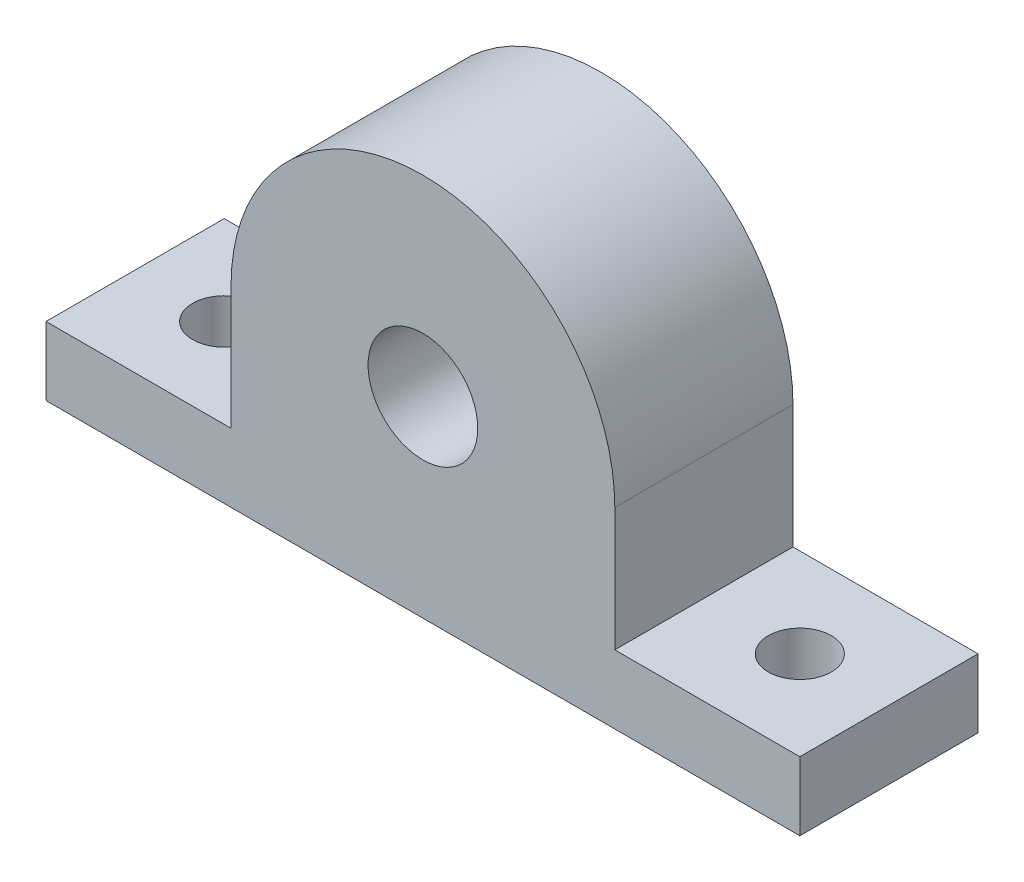
ISO-10303-21;
HEADER;
FILE_DESCRIPTION(('STEP AP214'),'2;1');
FILE_NAME('part.step','',(''),(''),'','','');
FILE_SCHEMA(('AUTOMOTIVE_DESIGN { 1 0 10303 214 1 1 1 1 }'));
ENDSEC;
DATA;
#1=APPLICATION_CONTEXT('core data for automotive mechanical design processes');
#2=APPLICATION_PROTOCOL_DEFINITION('international standard','automotive_design',2000,#1);
#3=PRODUCT_CONTEXT('',#1,'mechanical');
#4=PRODUCT('Part','Part','',(#3));
#5=PRODUCT_RELATED_PRODUCT_CATEGORY('part','',(#4));
#6=PRODUCT_DEFINITION_FORMATION('','',#4);
#7=PRODUCT_DEFINITION_CONTEXT('part definition',#1,'design');
#8=PRODUCT_DEFINITION('design','',#6,#7);
#9=PRODUCT_DEFINITION_SHAPE('','',#8);
#10=(LENGTH_UNIT() NAMED_UNIT(*) SI_UNIT(.MILLI.,.METRE.));
#11=(NAMED_UNIT(*) PLANE_ANGLE_UNIT() SI_UNIT($,.RADIAN.));
#12=(NAMED_UNIT(*) SI_UNIT($,.STERADIAN.) SOLID_ANGLE_UNIT());
#13=UNCERTAINTY_MEASURE_WITH_UNIT(LENGTH_MEASURE(1.E-05),#10,'distance_accuracy_value','');
#14=(GEOMETRIC_REPRESENTATION_CONTEXT(3) GLOBAL_UNCERTAINTY_ASSIGNED_CONTEXT((#13)) GLOBAL_UNIT_ASSIGNED_CONTEXT((#10,
#11,#12)) REPRESENTATION_CONTEXT('',''));
#15=CARTESIAN_POINT('',(0.,0.,0.));
#16=DIRECTION('',(0.,0.,1.));
#17=DIRECTION('',(1.,0.,0.));
#18=AXIS2_PLACEMENT_3D('',#15,#16,#17);
#19=CARTESIAN_POINT('',(0.,5.,0.));
#20=DIRECTION('',(0.,-1.,0.));
#21=DIRECTION('',(0.,0.,-1.));
#22=AXIS2_PLACEMENT_3D('',#19,#20,#21);
#23=PLANE('',#22);
#24=CARTESIAN_POINT('',(48.5,5.,-6.5));
#25=DIRECTION('',(0.,1.,0.));
#26=DIRECTION('',(0.,0.,1.));
#27=AXIS2_PLACEMENT_3D('',#24,#25,#26);
#28=CIRCLE('',#27,2.30000000000001);
#29=CARTESIAN_POINT('',(48.5,5.,-4.19999999999999));
#30=VERTEX_POINT('',#29);
#31=EDGE_CURVE('E208',#30,#30,#28,.T.);
#32=ORIENTED_EDGE('',*,*,#31,.F.);
#33=EDGE_LOOP('',(#32));
#34=FACE_BOUND('',#33,.T.);
#35=DIRECTION('',(-1.,0.,0.));
#36=VECTOR('',#35,1.);
#37=CARTESIAN_POINT('',(0.,5.,-13.));
#38=LINE('',#37,#36);
#39=CARTESIAN_POINT('',(55.,5.,-13.));
#40=VERTEX_POINT('',#39);
#41=CARTESIAN_POINT('',(41.5,5.,-13.));
#42=VERTEX_POINT('',#41);
#43=EDGE_CURVE('E55',#40,#42,#38,.T.);
#44=ORIENTED_EDGE('',*,*,#43,.T.);
#45=DIRECTION('',(0.,0.,1.));
#46=VECTOR('',#45,1.);
#47=CARTESIAN_POINT('',(41.5,5.,0.));
#48=LINE('',#47,#46);
#49=CARTESIAN_POINT('',(41.5,5.,0.));
#50=VERTEX_POINT('',#49);
#51=EDGE_CURVE('E137',#42,#50,#48,.T.);
#52=ORIENTED_EDGE('',*,*,#51,.T.);
#53=DIRECTION('',(1.,0.,0.));
#54=VECTOR('',#53,1.);
#55=CARTESIAN_POINT('',(0.,5.,0.));
#56=LINE('',#55,#54);
#57=CARTESIAN_POINT('',(55.,5.,0.));
#58=VERTEX_POINT('',#57);
#59=EDGE_CURVE('E143',#50,#58,#56,.T.);
#60=ORIENTED_EDGE('',*,*,#59,.T.);
#61=DIRECTION('',(0.,0.,-1.));
#62=VECTOR('',#61,1.);
#63=CARTESIAN_POINT('',(55.,5.,0.));
#64=LINE('',#63,#62);
#65=EDGE_CURVE('E147',#58,#40,#64,.T.);
#66=ORIENTED_EDGE('',*,*,#65,.T.);
#67=EDGE_LOOP('',(#44,#52,#60,#66));
#68=FACE_BOUND('',#67,.T.);
#69=ADVANCED_FACE('F32',(#34,#68),#23,.F.);
#70=CARTESIAN_POINT('',(0.,5.,0.));
#71=DIRECTION('',(1.,0.,0.));
#72=DIRECTION('',(0.,0.,-1.));
#73=AXIS2_PLACEMENT_3D('',#70,#71,#72);
#74=PLANE('',#73);
#75=DIRECTION('',(0.,0.,1.));
#76=VECTOR('',#75,1.);
#77=CARTESIAN_POINT('',(0.,0.,0.));
#78=LINE('',#77,#76);
#79=CARTESIAN_POINT('',(0.,0.,-13.));
#80=VERTEX_POINT('',#79);
#81=CARTESIAN_POINT('',(0.,0.,0.));
#82=VERTEX_POINT('',#81);
#83=EDGE_CURVE('E139',#80,#82,#78,.T.);
#84=ORIENTED_EDGE('',*,*,#83,.T.);
#85=DIRECTION('',(0.,-1.,0.));
#86=VECTOR('',#85,1.);
#87=CARTESIAN_POINT('',(0.,5.,0.));
#88=LINE('',#87,#86);
#89=CARTESIAN_POINT('',(0.,5.,0.));
#90=VERTEX_POINT('',#89);
#91=EDGE_CURVE('E11',#90,#82,#88,.T.);
#92=ORIENTED_EDGE('',*,*,#91,.F.);
#93=DIRECTION('',(0.,0.,1.));
#94=VECTOR('',#93,1.);
#95=CARTESIAN_POINT('',(0.,5.,0.));
#96=LINE('',#95,#94);
#97=CARTESIAN_POINT('',(0.,5.,-13.));
#98=VERTEX_POINT('',#97);
#99=EDGE_CURVE('E140',#98,#90,#96,.T.);
#100=ORIENTED_EDGE('',*,*,#99,.F.);
#101=DIRECTION('',(0.,-1.,0.));
#102=VECTOR('',#101,1.);
#103=CARTESIAN_POINT('',(0.,5.,-13.));
#104=LINE('',#103,#102);
#105=EDGE_CURVE('E150',#98,#80,#104,.T.);
#106=ORIENTED_EDGE('',*,*,#105,.T.);
#107=EDGE_LOOP('',(#84,#92,#100,#106));
#108=FACE_BOUND('',#107,.T.);
#109=ADVANCED_FACE('F34',(#108),#74,.F.);
#110=CARTESIAN_POINT('',(0.,5.,0.));
#111=DIRECTION('',(0.,0.,-1.));
#112=DIRECTION('',(-1.,0.,0.));
#113=AXIS2_PLACEMENT_3D('',#110,#111,#112);
#114=PLANE('',#113);
#115=DIRECTION('',(1.,0.,0.));
#116=VECTOR('',#115,1.);
#117=CARTESIAN_POINT('',(0.,0.,0.));
#118=LINE('',#117,#116);
#119=CARTESIAN_POINT('',(55.,0.,0.));
#120=VERTEX_POINT('',#119);
#121=EDGE_CURVE('E153',#82,#120,#118,.T.);
#122=ORIENTED_EDGE('',*,*,#121,.T.);
#123=DIRECTION('',(0.,-1.,0.));
#124=VECTOR('',#123,1.);
#125=CARTESIAN_POINT('',(55.,5.,0.));
#126=LINE('',#125,#124);
#127=EDGE_CURVE('E40',#58,#120,#126,.T.);
#128=ORIENTED_EDGE('',*,*,#127,.F.);
#129=ORIENTED_EDGE('',*,*,#59,.F.);
#130=DIRECTION('',(0.,1.,0.));
#131=VECTOR('',#130,1.);
#132=CARTESIAN_POINT('',(41.5,0.,0.));
#133=LINE('',#132,#131);
#134=CARTESIAN_POINT('',(41.5,14.,0.));
#135=VERTEX_POINT('',#134);
#136=EDGE_CURVE('E123',#50,#135,#133,.T.);
#137=ORIENTED_EDGE('',*,*,#136,.T.);
#138=CARTESIAN_POINT('',(27.5,14.,0.));
#139=DIRECTION('',(0.,0.,1.));
#140=DIRECTION('',(1.,0.,0.));
#141=AXIS2_PLACEMENT_3D('',#138,#139,#140);
#142=CIRCLE('',#141,14.);
#143=CARTESIAN_POINT('',(13.5,14.,0.));
#144=VERTEX_POINT('',#143);
#145=EDGE_CURVE('E131',#135,#144,#142,.T.);
#146=ORIENTED_EDGE('',*,*,#145,.T.);
#147=DIRECTION('',(0.,-1.,0.));
#148=VECTOR('',#147,1.);
#149=CARTESIAN_POINT('',(13.5,14.,0.));
#150=LINE('',#149,#148);
#151=CARTESIAN_POINT('',(13.5,5.,0.));
#152=VERTEX_POINT('',#151);
#153=EDGE_CURVE('E103',#144,#152,#150,.T.);
#154=ORIENTED_EDGE('',*,*,#153,.T.);
#155=EDGE_CURVE('E145',#90,#152,#56,.T.);
#156=ORIENTED_EDGE('',*,*,#155,.F.);
#157=ORIENTED_EDGE('',*,*,#91,.T.);
#158=EDGE_LOOP('',(#122,#128,#129,#137,#146,#154,#156,#157));
#159=FACE_BOUND('',#158,.T.);
#160=CARTESIAN_POINT('',(27.5,14.,0.));
#161=DIRECTION('',(0.,0.,1.));
#162=DIRECTION('',(1.,0.,0.));
#163=AXIS2_PLACEMENT_3D('',#160,#161,#162);
#164=CIRCLE('',#163,4.);
#165=CARTESIAN_POINT('',(31.5,14.,0.));
#166=VERTEX_POINT('',#165);
#167=EDGE_CURVE('E127',#166,#166,#164,.T.);
#168=ORIENTED_EDGE('',*,*,#167,.F.);
#169=EDGE_LOOP('',(#168));
#170=FACE_BOUND('',#169,.T.);
#171=ADVANCED_FACE('F178',(#159,#170),#114,.F.);
#172=CARTESIAN_POINT('',(55.,5.,0.));
#173=DIRECTION('',(-1.,0.,0.));
#174=DIRECTION('',(0.,0.,1.));
#175=AXIS2_PLACEMENT_3D('',#172,#173,#174);
#176=PLANE('',#175);
#177=DIRECTION('',(0.,0.,-1.));
#178=VECTOR('',#177,1.);
#179=CARTESIAN_POINT('',(55.,0.,0.));
#180=LINE('',#179,#178);
#181=CARTESIAN_POINT('',(55.,0.,-13.));
#182=VERTEX_POINT('',#181);
#183=EDGE_CURVE('E155',#120,#182,#180,.T.);
#184=ORIENTED_EDGE('',*,*,#183,.T.);
#185=DIRECTION('',(0.,-1.,0.));
#186=VECTOR('',#185,1.);
#187=CARTESIAN_POINT('',(55.,5.,-13.));
#188=LINE('',#187,#186);
#189=EDGE_CURVE('E160',#40,#182,#188,.T.);
#190=ORIENTED_EDGE('',*,*,#189,.F.);
#191=ORIENTED_EDGE('',*,*,#65,.F.);
#192=ORIENTED_EDGE('',*,*,#127,.T.);
#193=EDGE_LOOP('',(#184,#190,#191,#192));
#194=FACE_BOUND('',#193,.T.);
#195=ADVANCED_FACE('F167',(#194),#176,.F.);
#196=CARTESIAN_POINT('',(0.,5.,-13.));
#197=DIRECTION('',(0.,0.,1.));
#198=DIRECTION('',(1.,0.,0.));
#199=AXIS2_PLACEMENT_3D('',#196,#197,#198);
#200=PLANE('',#199);
#201=CARTESIAN_POINT('',(13.5,5.,-13.));
#202=VERTEX_POINT('',#201);
#203=EDGE_CURVE('E118',#202,#98,#38,.T.);
#204=ORIENTED_EDGE('',*,*,#203,.F.);
#205=DIRECTION('',(0.,-1.,0.));
#206=VECTOR('',#205,1.);
#207=CARTESIAN_POINT('',(13.5,14.,-13.));
#208=LINE('',#207,#206);
#209=CARTESIAN_POINT('',(13.5,14.,-13.));
#210=VERTEX_POINT('',#209);
#211=EDGE_CURVE('E101',#210,#202,#208,.T.);
#212=ORIENTED_EDGE('',*,*,#211,.F.);
#213=CARTESIAN_POINT('',(27.5,14.,-13.));
#214=DIRECTION('',(0.,0.,1.));
#215=DIRECTION('',(1.,0.,0.));
#216=AXIS2_PLACEMENT_3D('',#213,#214,#215);
#217=CIRCLE('',#216,14.);
#218=CARTESIAN_POINT('',(41.5,14.,-13.));
#219=VERTEX_POINT('',#218);
#220=EDGE_CURVE('E116',#219,#210,#217,.T.);
#221=ORIENTED_EDGE('',*,*,#220,.F.);
#222=DIRECTION('',(0.,1.,0.));
#223=VECTOR('',#222,1.);
#224=CARTESIAN_POINT('',(41.5,0.,-13.));
#225=LINE('',#224,#223);
#226=EDGE_CURVE('E109',#42,#219,#225,.T.);
#227=ORIENTED_EDGE('',*,*,#226,.F.);
#228=ORIENTED_EDGE('',*,*,#43,.F.);
#229=ORIENTED_EDGE('',*,*,#189,.T.);
#230=DIRECTION('',(-1.,0.,0.));
#231=VECTOR('',#230,1.);
#232=CARTESIAN_POINT('',(0.,0.,-13.));
#233=LINE('',#232,#231);
#234=EDGE_CURVE('E144',#182,#80,#233,.T.);
#235=ORIENTED_EDGE('',*,*,#234,.T.);
#236=ORIENTED_EDGE('',*,*,#105,.F.);
#237=EDGE_LOOP('',(#204,#212,#221,#227,#228,#229,#235,#236));
#238=FACE_BOUND('',#237,.T.);
#239=CARTESIAN_POINT('',(27.5,14.,-13.));
#240=DIRECTION('',(0.,0.,1.));
#241=DIRECTION('',(1.,0.,0.));
#242=AXIS2_PLACEMENT_3D('',#239,#240,#241);
#243=CIRCLE('',#242,4.);
#244=CARTESIAN_POINT('',(31.5,14.,-13.));
#245=VERTEX_POINT('',#244);
#246=EDGE_CURVE('E133',#245,#245,#243,.T.);
#247=ORIENTED_EDGE('',*,*,#246,.T.);
#248=EDGE_LOOP('',(#247));
#249=FACE_BOUND('',#248,.T.);
#250=ADVANCED_FACE('F113',(#238,#249),#200,.F.);
#251=CARTESIAN_POINT('',(6.5,5.,-6.5));
#252=DIRECTION('',(0.,1.,0.));
#253=DIRECTION('',(0.,0.,1.));
#254=AXIS2_PLACEMENT_3D('',#251,#252,#253);
#255=CIRCLE('',#254,2.3);
#256=CARTESIAN_POINT('',(6.5,5.,-4.2));
#257=VERTEX_POINT('',#256);
#258=EDGE_CURVE('E202',#257,#257,#255,.T.);
#259=ORIENTED_EDGE('',*,*,#258,.F.);
#260=EDGE_LOOP('',(#259));
#261=FACE_BOUND('',#260,.T.);
#262=ORIENTED_EDGE('',*,*,#155,.T.);
#263=DIRECTION('',(0.,0.,-1.));
#264=VECTOR('',#263,1.);
#265=CARTESIAN_POINT('',(13.5,5.,0.));
#266=LINE('',#265,#264);
#267=EDGE_CURVE('E47',#152,#202,#266,.T.);
#268=ORIENTED_EDGE('',*,*,#267,.T.);
#269=ORIENTED_EDGE('',*,*,#203,.T.);
#270=ORIENTED_EDGE('',*,*,#99,.T.);
#271=EDGE_LOOP('',(#262,#268,#269,#270));
#272=FACE_BOUND('',#271,.T.);
#273=ADVANCED_FACE('F177',(#261,#272),#23,.F.);
#274=CARTESIAN_POINT('',(0.,0.,0.));
#275=DIRECTION('',(0.,-1.,0.));
#276=DIRECTION('',(0.,0.,-1.));
#277=AXIS2_PLACEMENT_3D('',#274,#275,#276);
#278=PLANE('',#277);
#279=CARTESIAN_POINT('',(6.5,0.,-6.5));
#280=DIRECTION('',(0.,-1.,0.));
#281=DIRECTION('',(0.,0.,-1.));
#282=AXIS2_PLACEMENT_3D('',#279,#280,#281);
#283=CIRCLE('',#282,2.3);
#284=CARTESIAN_POINT('',(6.5,0.,-8.8));
#285=VERTEX_POINT('',#284);
#286=EDGE_CURVE('E205',#285,#285,#283,.F.);
#287=ORIENTED_EDGE('',*,*,#286,.T.);
#288=EDGE_LOOP('',(#287));
#289=FACE_BOUND('',#288,.T.);
#290=CARTESIAN_POINT('',(48.5,0.,-6.5));
#291=DIRECTION('',(0.,-1.,0.));
#292=DIRECTION('',(0.,0.,-1.));
#293=AXIS2_PLACEMENT_3D('',#290,#291,#292);
#294=CIRCLE('',#293,2.30000000000001);
#295=CARTESIAN_POINT('',(48.5,0.,-8.80000000000001));
#296=VERTEX_POINT('',#295);
#297=EDGE_CURVE('E204',#296,#296,#294,.F.);
#298=ORIENTED_EDGE('',*,*,#297,.T.);
#299=EDGE_LOOP('',(#298));
#300=FACE_BOUND('',#299,.T.);
#301=ORIENTED_EDGE('',*,*,#83,.F.);
#302=ORIENTED_EDGE('',*,*,#234,.F.);
#303=ORIENTED_EDGE('',*,*,#183,.F.);
#304=ORIENTED_EDGE('',*,*,#121,.F.);
#305=EDGE_LOOP('',(#301,#302,#303,#304));
#306=FACE_BOUND('',#305,.T.);
#307=ADVANCED_FACE('F173',(#289,#300,#306),#278,.T.);
#308=CARTESIAN_POINT('',(41.5,0.,-13.));
#309=DIRECTION('',(1.,0.,0.));
#310=DIRECTION('',(0.,0.,-1.));
#311=AXIS2_PLACEMENT_3D('',#308,#309,#310);
#312=PLANE('',#311);
#313=ORIENTED_EDGE('',*,*,#51,.F.);
#314=ORIENTED_EDGE('',*,*,#226,.T.);
#315=DIRECTION('',(0.,0.,1.));
#316=VECTOR('',#315,1.);
#317=CARTESIAN_POINT('',(41.5,14.,-13.));
#318=LINE('',#317,#316);
#319=EDGE_CURVE('E108',#219,#135,#318,.T.);
#320=ORIENTED_EDGE('',*,*,#319,.T.);
#321=ORIENTED_EDGE('',*,*,#136,.F.);
#322=EDGE_LOOP('',(#313,#314,#320,#321));
#323=FACE_BOUND('',#322,.T.);
#324=ADVANCED_FACE('F182',(#323),#312,.T.);
#325=CARTESIAN_POINT('',(13.5,14.,-13.));
#326=DIRECTION('',(-1.,0.,0.));
#327=DIRECTION('',(0.,0.,1.));
#328=AXIS2_PLACEMENT_3D('',#325,#326,#327);
#329=PLANE('',#328);
#330=ORIENTED_EDGE('',*,*,#267,.F.);
#331=ORIENTED_EDGE('',*,*,#153,.F.);
#332=DIRECTION('',(0.,0.,1.));
#333=VECTOR('',#332,1.);
#334=CARTESIAN_POINT('',(13.5,14.,-13.));
#335=LINE('',#334,#333);
#336=EDGE_CURVE('E98',#210,#144,#335,.T.);
#337=ORIENTED_EDGE('',*,*,#336,.F.);
#338=ORIENTED_EDGE('',*,*,#211,.T.);
#339=EDGE_LOOP('',(#330,#331,#337,#338));
#340=FACE_BOUND('',#339,.T.);
#341=ADVANCED_FACE('F100',(#340),#329,.T.);
#342=CARTESIAN_POINT('',(27.5,14.,-13.));
#343=DIRECTION('',(0.,0.,1.));
#344=DIRECTION('',(1.,0.,0.));
#345=AXIS2_PLACEMENT_3D('',#342,#343,#344);
#346=CYLINDRICAL_SURFACE('',#345,14.);
#347=ORIENTED_EDGE('',*,*,#145,.F.);
#348=ORIENTED_EDGE('',*,*,#319,.F.);
#349=ORIENTED_EDGE('',*,*,#220,.T.);
#350=ORIENTED_EDGE('',*,*,#336,.T.);
#351=EDGE_LOOP('',(#347,#348,#349,#350));
#352=FACE_BOUND('',#351,.T.);
#353=ADVANCED_FACE('F121',(#352),#346,.T.);
#354=CARTESIAN_POINT('',(27.5,14.,-13.));
#355=DIRECTION('',(0.,0.,1.));
#356=DIRECTION('',(1.,0.,0.));
#357=AXIS2_PLACEMENT_3D('',#354,#355,#356);
#358=CYLINDRICAL_SURFACE('',#357,4.);
#359=CARTESIAN_POINT('',(31.5,14.,-13.));
#360=CARTESIAN_POINT('',(31.5,14.,-12.8645833333333));
#361=CARTESIAN_POINT('',(31.5,14.,-12.7291666666667));
#362=CARTESIAN_POINT('',(31.5,14.,-12.4583333333333));
#363=CARTESIAN_POINT('',(31.5,14.,-12.3229166666667));
#364=CARTESIAN_POINT('',(31.5,14.,-12.0520833333333));
#365=CARTESIAN_POINT('',(31.5,14.,-11.9166666666667));
#366=CARTESIAN_POINT('',(31.5,14.,-11.6458333333333));
#367=CARTESIAN_POINT('',(31.5,14.,-11.5104166666667));
#368=CARTESIAN_POINT('',(31.5,14.,-11.2395833333333));
#369=CARTESIAN_POINT('',(31.5,14.,-11.1041666666667));
#370=CARTESIAN_POINT('',(31.5,14.,-10.8333333333333));
#371=CARTESIAN_POINT('',(31.5,14.,-10.6979166666667));
#372=CARTESIAN_POINT('',(31.5,14.,-10.4270833333333));
#373=CARTESIAN_POINT('',(31.5,14.,-10.2916666666667));
#374=CARTESIAN_POINT('',(31.5,14.,-10.0208333333333));
#375=CARTESIAN_POINT('',(31.5,14.,-9.88541666666667));
#376=CARTESIAN_POINT('',(31.5,14.,-9.61458333333333));
#377=CARTESIAN_POINT('',(31.5,14.,-9.47916666666667));
#378=CARTESIAN_POINT('',(31.5,14.,-9.20833333333333));
#379=CARTESIAN_POINT('',(31.5,14.,-9.07291666666667));
#380=CARTESIAN_POINT('',(31.5,14.,-8.80208333333333));
#381=CARTESIAN_POINT('',(31.5,14.,-8.66666666666667));
#382=CARTESIAN_POINT('',(31.5,14.,-8.39583333333333));
#383=CARTESIAN_POINT('',(31.5,14.,-8.26041666666667));
#384=CARTESIAN_POINT('',(31.5,14.,-7.98958333333333));
#385=CARTESIAN_POINT('',(31.5,14.,-7.85416666666667));
#386=CARTESIAN_POINT('',(31.5,14.,-7.58333333333333));
#387=CARTESIAN_POINT('',(31.5,14.,-7.44791666666667));
#388=CARTESIAN_POINT('',(31.5,14.,-7.17708333333333));
#389=CARTESIAN_POINT('',(31.5,14.,-7.04166666666667));
#390=CARTESIAN_POINT('',(31.5,14.,-6.77083333333333));
#391=CARTESIAN_POINT('',(31.5,14.,-6.63541666666667));
#392=CARTESIAN_POINT('',(31.5,14.,-6.36458333333333));
#393=CARTESIAN_POINT('',(31.5,14.,-6.22916666666667));
#394=CARTESIAN_POINT('',(31.5,14.,-5.95833333333333));
#395=CARTESIAN_POINT('',(31.5,14.,-5.82291666666667));
#396=CARTESIAN_POINT('',(31.5,14.,-5.55208333333333));
#397=CARTESIAN_POINT('',(31.5,14.,-5.41666666666667));
#398=CARTESIAN_POINT('',(31.5,14.,-5.14583333333333));
#399=CARTESIAN_POINT('',(31.5,14.,-5.01041666666667));
#400=CARTESIAN_POINT('',(31.5,14.,-4.73958333333333));
#401=CARTESIAN_POINT('',(31.5,14.,-4.60416666666667));
#402=CARTESIAN_POINT('',(31.5,14.,-4.33333333333333));
#403=CARTESIAN_POINT('',(31.5,14.,-4.19791666666667));
#404=CARTESIAN_POINT('',(31.5,14.,-3.92708333333333));
#405=CARTESIAN_POINT('',(31.5,14.,-3.79166666666667));
#406=CARTESIAN_POINT('',(31.5,14.,-3.52083333333333));
#407=CARTESIAN_POINT('',(31.5,14.,-3.38541666666667));
#408=CARTESIAN_POINT('',(31.5,14.,-3.11458333333333));
#409=CARTESIAN_POINT('',(31.5,14.,-2.97916666666667));
#410=CARTESIAN_POINT('',(31.5,14.,-2.70833333333333));
#411=CARTESIAN_POINT('',(31.5,14.,-2.57291666666667));
#412=CARTESIAN_POINT('',(31.5,14.,-2.30208333333333));
#413=CARTESIAN_POINT('',(31.5,14.,-2.16666666666667));
#414=CARTESIAN_POINT('',(31.5,14.,-1.89583333333333));
#415=CARTESIAN_POINT('',(31.5,14.,-1.76041666666667));
#416=CARTESIAN_POINT('',(31.5,14.,-1.48958333333333));
#417=CARTESIAN_POINT('',(31.5,14.,-1.35416666666667));
#418=CARTESIAN_POINT('',(31.5,14.,-1.08333333333333));
#419=CARTESIAN_POINT('',(31.5,14.,-0.947916666666667));
#420=CARTESIAN_POINT('',(31.5,14.,-0.677083333333334));
#421=CARTESIAN_POINT('',(31.5,14.,-0.541666666666667));
#422=CARTESIAN_POINT('',(31.5,14.,-0.270833333333334));
#423=CARTESIAN_POINT('',(31.5,14.,-0.135416666666667));
#424=CARTESIAN_POINT('',(31.5,14.,0.));
#425=B_SPLINE_CURVE_WITH_KNOTS('',3,(#359,#360,#361,#362,#363,#364,#365,#366,#367,#368,#369,
#370,#371,#372,#373,#374,#375,#376,#377,#378,#379,#380,#381,#382,#383,#384,#385,#386,#387,#388,
#389,#390,#391,#392,#393,#394,#395,#396,#397,#398,#399,#400,#401,#402,#403,#404,#405,#406,#407,
#408,#409,#410,#411,#412,#413,#414,#415,#416,#417,#418,#419,#420,#421,#422,#423,#424),
.UNSPECIFIED.,.F.,.F.,(4,2,2,2,2,2,2,2,2,2,2,2,2,2,2,2,2,2,2,2,2,2,2,2,2,2,2,2,2,2,2,2,4),(0.,
0.406249999999999,0.812499999999999,1.21875,1.625,2.03125,2.4375,2.84375,3.25,3.65625,4.0625,
4.46875,4.875,5.28125,5.6875,6.09375,6.5,6.90625,7.3125,7.71875,8.125,8.53125,8.9375,9.34375,
9.75,10.15625,10.5625,10.96875,11.375,11.78125,12.1875,12.59375,13.),.UNSPECIFIED.);
#426=EDGE_CURVE('BSEAM219',#245,#166,#425,.T.);
#427=ORIENTED_EDGE('',*,*,#246,.F.);
#428=ORIENTED_EDGE('',*,*,#167,.T.);
#429=ORIENTED_EDGE('',*,*,#426,.T.);
#430=ORIENTED_EDGE('',*,*,#426,.F.);
#431=EDGE_LOOP('',(#427,#429,#428,#430));
#432=FACE_BOUND('',#431,.T.);
#433=ADVANCED_FACE('F219',(#432),#358,.F.);
#434=CARTESIAN_POINT('',(48.5,-0.00100000000000013,-6.5));
#435=DIRECTION('',(0.,1.,0.));
#436=DIRECTION('',(0.,0.,1.));
#437=AXIS2_PLACEMENT_3D('',#434,#435,#436);
#438=CYLINDRICAL_SURFACE('',#437,2.30000000000001);
#439=ORIENTED_EDGE('',*,*,#297,.F.);
#440=EDGE_LOOP('',(#439));
#441=FACE_BOUND('',#440,.T.);
#442=ORIENTED_EDGE('',*,*,#31,.T.);
#443=EDGE_LOOP('',(#442));
#444=FACE_BOUND('',#443,.T.);
#445=ADVANCED_FACE('F266',(#441,#444),#438,.F.);
#446=CARTESIAN_POINT('',(6.5,-0.00100000000000013,-6.5));
#447=DIRECTION('',(0.,1.,0.));
#448=DIRECTION('',(0.,0.,1.));
#449=AXIS2_PLACEMENT_3D('',#446,#447,#448);
#450=CYLINDRICAL_SURFACE('',#449,2.3);
#451=ORIENTED_EDGE('',*,*,#286,.F.);
#452=EDGE_LOOP('',(#451));
#453=FACE_BOUND('',#452,.T.);
#454=ORIENTED_EDGE('',*,*,#258,.T.);
#455=EDGE_LOOP('',(#454));
#456=FACE_BOUND('',#455,.T.);
#457=ADVANCED_FACE('F291',(#453,#456),#450,.F.);
#458=CLOSED_SHELL('',(#69,#109,#171,#195,#250,#273,#307,#324,#341,#353,#433,#445,#457));
#459=MANIFOLD_SOLID_BREP('B2',#458);
#460=ADVANCED_BREP_SHAPE_REPRESENTATION('',(#18,#459),#14);
#461=SHAPE_DEFINITION_REPRESENTATION(#9,#460);
ENDSEC;
END-ISO-10303-21;
